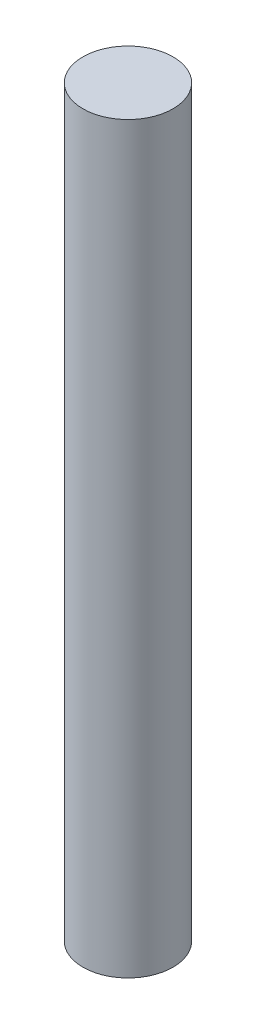
ISO-10303-21;
HEADER;
FILE_DESCRIPTION(('STEP AP214'),'2;1');
FILE_NAME('part.step','',(''),(''),'','','');
FILE_SCHEMA(('AUTOMOTIVE_DESIGN { 1 0 10303 214 1 1 1 1 }'));
ENDSEC;
DATA;
#1=APPLICATION_CONTEXT('core data for automotive mechanical design processes');
#2=APPLICATION_PROTOCOL_DEFINITION('international standard','automotive_design',2000,#1);
#3=PRODUCT_CONTEXT('',#1,'mechanical');
#4=PRODUCT('Part','Part','',(#3));
#5=PRODUCT_RELATED_PRODUCT_CATEGORY('part','',(#4));
#6=PRODUCT_DEFINITION_FORMATION('','',#4);
#7=PRODUCT_DEFINITION_CONTEXT('part definition',#1,'design');
#8=PRODUCT_DEFINITION('design','',#6,#7);
#9=PRODUCT_DEFINITION_SHAPE('','',#8);
#10=(LENGTH_UNIT() NAMED_UNIT(*) SI_UNIT(.MILLI.,.METRE.));
#11=(NAMED_UNIT(*) PLANE_ANGLE_UNIT() SI_UNIT($,.RADIAN.));
#12=(NAMED_UNIT(*) SI_UNIT($,.STERADIAN.) SOLID_ANGLE_UNIT());
#13=UNCERTAINTY_MEASURE_WITH_UNIT(LENGTH_MEASURE(1.E-05),#10,'distance_accuracy_value','');
#14=(GEOMETRIC_REPRESENTATION_CONTEXT(3) GLOBAL_UNCERTAINTY_ASSIGNED_CONTEXT((#13)) GLOBAL_UNIT_ASSIGNED_CONTEXT((#10,
#11,#12)) REPRESENTATION_CONTEXT('',''));
#15=CARTESIAN_POINT('',(0.,0.,0.));
#16=DIRECTION('',(0.,0.,1.));
#17=DIRECTION('',(1.,0.,0.));
#18=AXIS2_PLACEMENT_3D('',#15,#16,#17);
#19=CARTESIAN_POINT('',(0.,33.,0.));
#20=DIRECTION('',(0.,-1.,0.));
#21=DIRECTION('',(0.,0.,-1.));
#22=AXIS2_PLACEMENT_3D('',#19,#20,#21);
#23=CYLINDRICAL_SURFACE('',#22,2.);
#24=CARTESIAN_POINT('',(0.,33.,0.));
#25=DIRECTION('',(0.,1.,0.));
#26=DIRECTION('',(0.,0.,1.));
#27=AXIS2_PLACEMENT_3D('',#24,#25,#26);
#28=CIRCLE('',#27,2.);
#29=CARTESIAN_POINT('',(0.,33.,2.));
#30=VERTEX_POINT('',#29);
#31=EDGE_CURVE('E10',#30,#30,#28,.T.);
#32=ORIENTED_EDGE('',*,*,#31,.F.);
#33=EDGE_LOOP('',(#32));
#34=FACE_BOUND('',#33,.T.);
#35=CARTESIAN_POINT('',(0.,0.,0.));
#36=DIRECTION('',(0.,1.,0.));
#37=DIRECTION('',(0.,0.,1.));
#38=AXIS2_PLACEMENT_3D('',#35,#36,#37);
#39=CIRCLE('',#38,2.);
#40=CARTESIAN_POINT('',(0.,0.,2.));
#41=VERTEX_POINT('',#40);
#42=EDGE_CURVE('E41',#41,#41,#39,.T.);
#43=ORIENTED_EDGE('',*,*,#42,.T.);
#44=EDGE_LOOP('',(#43));
#45=FACE_BOUND('',#44,.T.);
#46=ADVANCED_FACE('F38',(#34,#45),#23,.T.);
#47=CARTESIAN_POINT('',(0.,33.,0.));
#48=DIRECTION('',(0.,1.,0.));
#49=DIRECTION('',(0.,0.,1.));
#50=AXIS2_PLACEMENT_3D('',#47,#48,#49);
#51=PLANE('',#50);
#52=ORIENTED_EDGE('',*,*,#31,.T.);
#53=EDGE_LOOP('',(#52));
#54=FACE_BOUND('',#53,.T.);
#55=ADVANCED_FACE('F53',(#54),#51,.T.);
#56=CARTESIAN_POINT('',(0.,0.,0.));
#57=DIRECTION('',(0.,1.,0.));
#58=DIRECTION('',(0.,0.,1.));
#59=AXIS2_PLACEMENT_3D('',#56,#57,#58);
#60=PLANE('',#59);
#61=ORIENTED_EDGE('',*,*,#42,.F.);
#62=EDGE_LOOP('',(#61));
#63=FACE_BOUND('',#62,.T.);
#64=ADVANCED_FACE('F51',(#63),#60,.F.);
#65=CLOSED_SHELL('',(#46,#55,#64));
#66=MANIFOLD_SOLID_BREP('B2',#65);
#67=ADVANCED_BREP_SHAPE_REPRESENTATION('',(#18,#66),#14);
#68=SHAPE_DEFINITION_REPRESENTATION(#9,#67);
ENDSEC;
END-ISO-10303-21;
